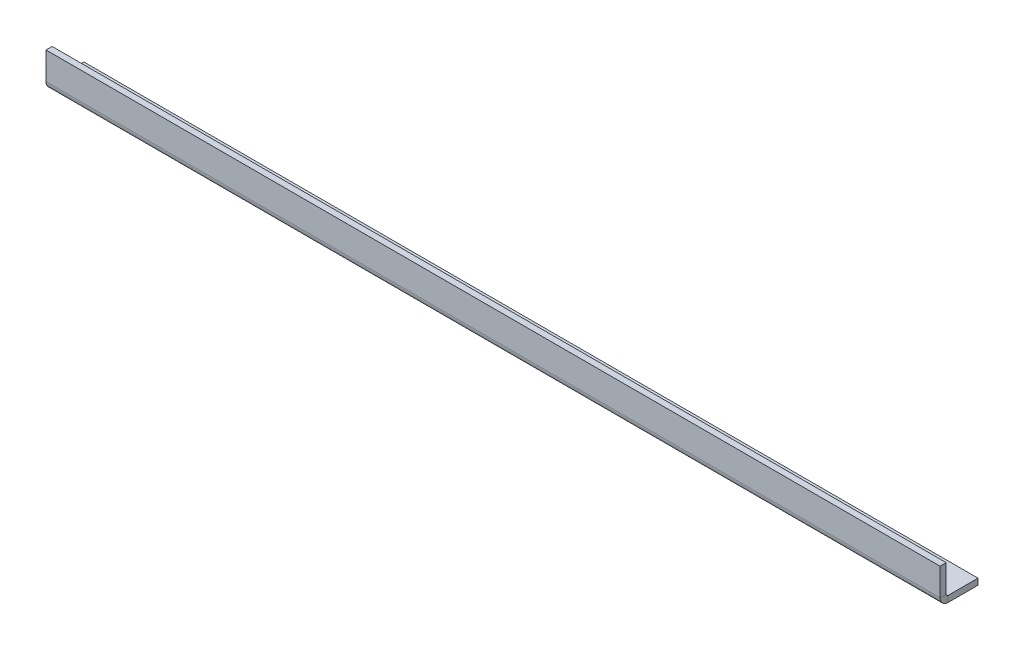
ISO-10303-21;
HEADER;
FILE_DESCRIPTION(('STEP AP214'),'2;1');
FILE_NAME('part.step','',(''),(''),'','','');
FILE_SCHEMA(('AUTOMOTIVE_DESIGN { 1 0 10303 214 1 1 1 1 }'));
ENDSEC;
DATA;
#1=APPLICATION_CONTEXT('core data for automotive mechanical design processes');
#2=APPLICATION_PROTOCOL_DEFINITION('international standard','automotive_design',2000,#1);
#3=PRODUCT_CONTEXT('',#1,'mechanical');
#4=PRODUCT('Part','Part','',(#3));
#5=PRODUCT_RELATED_PRODUCT_CATEGORY('part','',(#4));
#6=PRODUCT_DEFINITION_FORMATION('','',#4);
#7=PRODUCT_DEFINITION_CONTEXT('part definition',#1,'design');
#8=PRODUCT_DEFINITION('design','',#6,#7);
#9=PRODUCT_DEFINITION_SHAPE('','',#8);
#10=(LENGTH_UNIT() NAMED_UNIT(*) SI_UNIT(.MILLI.,.METRE.));
#11=(NAMED_UNIT(*) PLANE_ANGLE_UNIT() SI_UNIT($,.RADIAN.));
#12=(NAMED_UNIT(*) SI_UNIT($,.STERADIAN.) SOLID_ANGLE_UNIT());
#13=UNCERTAINTY_MEASURE_WITH_UNIT(LENGTH_MEASURE(1.E-05),#10,'distance_accuracy_value','');
#14=(GEOMETRIC_REPRESENTATION_CONTEXT(3) GLOBAL_UNCERTAINTY_ASSIGNED_CONTEXT((#13)) GLOBAL_UNIT_ASSIGNED_CONTEXT((#10,
#11,#12)) REPRESENTATION_CONTEXT('',''));
#15=CARTESIAN_POINT('',(0.,0.,0.));
#16=DIRECTION('',(0.,0.,1.));
#17=DIRECTION('',(1.,0.,0.));
#18=AXIS2_PLACEMENT_3D('',#15,#16,#17);
#19=CARTESIAN_POINT('',(232.0925,-3.175,-7.62));
#20=DIRECTION('',(1.,0.,0.));
#21=DIRECTION('',(0.,0.,-1.));
#22=AXIS2_PLACEMENT_3D('',#19,#20,#21);
#23=PLANE('',#22);
#24=DIRECTION('',(0.,0.,-1.));
#25=VECTOR('',#24,1.);
#26=CARTESIAN_POINT('',(232.0925,0.,-7.62));
#27=LINE('',#26,#25);
#28=CARTESIAN_POINT('',(232.0925,0.,7.89));
#29=VERTEX_POINT('',#28);
#30=CARTESIAN_POINT('',(232.0925,0.,-7.62));
#31=VERTEX_POINT('',#30);
#32=EDGE_CURVE('E183',#29,#31,#27,.T.);
#33=ORIENTED_EDGE('',*,*,#32,.F.);
#34=DIRECTION('',(0.,-1.,0.));
#35=VECTOR('',#34,1.);
#36=CARTESIAN_POINT('',(232.0925,0.,7.89));
#37=LINE('',#36,#35);
#38=CARTESIAN_POINT('',(232.0925,-3.175,7.89));
#39=VERTEX_POINT('',#38);
#40=EDGE_CURVE('E170',#29,#39,#37,.T.);
#41=ORIENTED_EDGE('',*,*,#40,.T.);
#42=DIRECTION('',(0.,0.,-1.));
#43=VECTOR('',#42,1.);
#44=CARTESIAN_POINT('',(232.0925,-3.175,-7.62));
#45=LINE('',#44,#43);
#46=CARTESIAN_POINT('',(232.0925,-3.175,-7.62));
#47=VERTEX_POINT('',#46);
#48=EDGE_CURVE('E186',#39,#47,#45,.T.);
#49=ORIENTED_EDGE('',*,*,#48,.T.);
#50=DIRECTION('',(0.,1.,0.));
#51=VECTOR('',#50,1.);
#52=CARTESIAN_POINT('',(232.0925,-3.175,-7.62));
#53=LINE('',#52,#51);
#54=EDGE_CURVE('E59',#47,#31,#53,.T.);
#55=ORIENTED_EDGE('',*,*,#54,.T.);
#56=EDGE_LOOP('',(#33,#41,#49,#55));
#57=FACE_BOUND('',#56,.T.);
#58=ADVANCED_FACE('F56',(#57),#23,.T.);
#59=CARTESIAN_POINT('',(-232.0925,-3.175,-7.62));
#60=DIRECTION('',(-1.,0.,0.));
#61=DIRECTION('',(0.,0.,1.));
#62=AXIS2_PLACEMENT_3D('',#59,#60,#61);
#63=PLANE('',#62);
#64=DIRECTION('',(0.,0.,1.));
#65=VECTOR('',#64,1.);
#66=CARTESIAN_POINT('',(-232.0925,0.,-7.62));
#67=LINE('',#66,#65);
#68=CARTESIAN_POINT('',(-232.0925,0.,-7.62));
#69=VERTEX_POINT('',#68);
#70=CARTESIAN_POINT('',(-232.0925,0.,7.89));
#71=VERTEX_POINT('',#70);
#72=EDGE_CURVE('E189',#69,#71,#67,.T.);
#73=ORIENTED_EDGE('',*,*,#72,.F.);
#74=DIRECTION('',(0.,1.,0.));
#75=VECTOR('',#74,1.);
#76=CARTESIAN_POINT('',(-232.0925,-3.175,-7.62));
#77=LINE('',#76,#75);
#78=CARTESIAN_POINT('',(-232.0925,-3.175,-7.62));
#79=VERTEX_POINT('',#78);
#80=EDGE_CURVE('E13',#79,#69,#77,.T.);
#81=ORIENTED_EDGE('',*,*,#80,.F.);
#82=DIRECTION('',(0.,0.,1.));
#83=VECTOR('',#82,1.);
#84=CARTESIAN_POINT('',(-232.0925,-3.175,-7.62));
#85=LINE('',#84,#83);
#86=CARTESIAN_POINT('',(-232.0925,-3.175,7.89));
#87=VERTEX_POINT('',#86);
#88=EDGE_CURVE('E192',#79,#87,#85,.T.);
#89=ORIENTED_EDGE('',*,*,#88,.T.);
#90=DIRECTION('',(0.,-1.,0.));
#91=VECTOR('',#90,1.);
#92=CARTESIAN_POINT('',(-232.0925,0.,7.89));
#93=LINE('',#92,#91);
#94=EDGE_CURVE('E181',#71,#87,#93,.T.);
#95=ORIENTED_EDGE('',*,*,#94,.F.);
#96=EDGE_LOOP('',(#73,#81,#89,#95));
#97=FACE_BOUND('',#96,.T.);
#98=ADVANCED_FACE('F204',(#97),#63,.T.);
#99=CARTESIAN_POINT('',(-232.0925,-3.175,-7.62));
#100=DIRECTION('',(0.,0.,-1.));
#101=DIRECTION('',(-1.,0.,0.));
#102=AXIS2_PLACEMENT_3D('',#99,#100,#101);
#103=PLANE('',#102);
#104=DIRECTION('',(-1.,0.,0.));
#105=VECTOR('',#104,1.);
#106=CARTESIAN_POINT('',(-232.0925,0.,-7.62));
#107=LINE('',#106,#105);
#108=EDGE_CURVE('E196',#31,#69,#107,.T.);
#109=ORIENTED_EDGE('',*,*,#108,.F.);
#110=ORIENTED_EDGE('',*,*,#54,.F.);
#111=DIRECTION('',(-1.,0.,0.));
#112=VECTOR('',#111,1.);
#113=CARTESIAN_POINT('',(-232.0925,-3.175,-7.62));
#114=LINE('',#113,#112);
#115=EDGE_CURVE('E188',#47,#79,#114,.T.);
#116=ORIENTED_EDGE('',*,*,#115,.T.);
#117=ORIENTED_EDGE('',*,*,#80,.T.);
#118=EDGE_LOOP('',(#109,#110,#116,#117));
#119=FACE_BOUND('',#118,.T.);
#120=ADVANCED_FACE('F229',(#119),#103,.T.);
#121=CARTESIAN_POINT('',(0.,-3.175,0.));
#122=DIRECTION('',(0.,1.,0.));
#123=DIRECTION('',(0.,0.,1.));
#124=AXIS2_PLACEMENT_3D('',#121,#122,#123);
#125=PLANE('',#124);
#126=ORIENTED_EDGE('',*,*,#48,.F.);
#127=DIRECTION('',(1.,0.,0.));
#128=VECTOR('',#127,1.);
#129=CARTESIAN_POINT('',(232.0925,-3.175,7.89));
#130=LINE('',#129,#128);
#131=EDGE_CURVE('E165',#39,#87,#130,.F.);
#132=ORIENTED_EDGE('',*,*,#131,.T.);
#133=ORIENTED_EDGE('',*,*,#88,.F.);
#134=ORIENTED_EDGE('',*,*,#115,.F.);
#135=EDGE_LOOP('',(#126,#132,#133,#134));
#136=FACE_BOUND('',#135,.T.);
#137=ADVANCED_FACE('F223',(#136),#125,.F.);
#138=CARTESIAN_POINT('',(0.,0.,0.));
#139=DIRECTION('',(0.,1.,0.));
#140=DIRECTION('',(0.,0.,1.));
#141=AXIS2_PLACEMENT_3D('',#138,#139,#140);
#142=PLANE('',#141);
#143=ORIENTED_EDGE('',*,*,#32,.T.);
#144=ORIENTED_EDGE('',*,*,#108,.T.);
#145=ORIENTED_EDGE('',*,*,#72,.T.);
#146=DIRECTION('',(1.,0.,0.));
#147=VECTOR('',#146,1.);
#148=CARTESIAN_POINT('',(232.0925,0.,7.89));
#149=LINE('',#148,#147);
#150=EDGE_CURVE('E176',#29,#71,#149,.F.);
#151=ORIENTED_EDGE('',*,*,#150,.F.);
#152=EDGE_LOOP('',(#143,#144,#145,#151));
#153=FACE_BOUND('',#152,.T.);
#154=ADVANCED_FACE('F203',(#153),#142,.T.);
#155=CARTESIAN_POINT('',(-232.0925,1.,7.89));
#156=DIRECTION('',(-1.,0.,0.));
#157=DIRECTION('',(0.,0.,1.));
#158=AXIS2_PLACEMENT_3D('',#155,#156,#157);
#159=PLANE('',#158);
#160=DIRECTION('',(0.,0.,-1.));
#161=VECTOR('',#160,1.);
#162=CARTESIAN_POINT('',(-232.0925,0.999999999999997,12.065));
#163=LINE('',#162,#161);
#164=CARTESIAN_POINT('',(-232.0925,1.,8.89));
#165=VERTEX_POINT('',#164);
#166=CARTESIAN_POINT('',(-232.0925,1.,12.065));
#167=VERTEX_POINT('',#166);
#168=EDGE_CURVE('E147',#165,#167,#163,.F.);
#169=ORIENTED_EDGE('',*,*,#168,.F.);
#170=CARTESIAN_POINT('',(-232.0925,1.,7.89));
#171=DIRECTION('',(1.,0.,0.));
#172=DIRECTION('',(0.,0.,-1.));
#173=AXIS2_PLACEMENT_3D('',#170,#171,#172);
#174=CIRCLE('',#173,0.999999999999999);
#175=EDGE_CURVE('E173',#71,#165,#174,.F.);
#176=ORIENTED_EDGE('',*,*,#175,.F.);
#177=ORIENTED_EDGE('',*,*,#94,.T.);
#178=CARTESIAN_POINT('',(-232.0925,1.,7.89));
#179=DIRECTION('',(1.,0.,0.));
#180=DIRECTION('',(0.,0.,-1.));
#181=AXIS2_PLACEMENT_3D('',#178,#179,#180);
#182=CIRCLE('',#181,4.175);
#183=EDGE_CURVE('E88',#87,#167,#182,.F.);
#184=ORIENTED_EDGE('',*,*,#183,.T.);
#185=EDGE_LOOP('',(#169,#176,#177,#184));
#186=FACE_BOUND('',#185,.T.);
#187=ADVANCED_FACE('F207',(#186),#159,.T.);
#188=CARTESIAN_POINT('',(232.0925,1.,7.89));
#189=DIRECTION('',(-1.,0.,0.));
#190=DIRECTION('',(0.,0.,1.));
#191=AXIS2_PLACEMENT_3D('',#188,#189,#190);
#192=PLANE('',#191);
#193=CARTESIAN_POINT('',(232.0925,1.,7.89));
#194=DIRECTION('',(1.,0.,0.));
#195=DIRECTION('',(0.,0.,-1.));
#196=AXIS2_PLACEMENT_3D('',#193,#194,#195);
#197=CIRCLE('',#196,0.999999999999999);
#198=CARTESIAN_POINT('',(232.0925,1.,8.89));
#199=VERTEX_POINT('',#198);
#200=EDGE_CURVE('E178',#199,#29,#197,.T.);
#201=ORIENTED_EDGE('',*,*,#200,.F.);
#202=DIRECTION('',(0.,0.,-1.));
#203=VECTOR('',#202,1.);
#204=CARTESIAN_POINT('',(232.0925,1.00000000000001,8.89));
#205=LINE('',#204,#203);
#206=CARTESIAN_POINT('',(232.0925,1.00000000000001,12.065));
#207=VERTEX_POINT('',#206);
#208=EDGE_CURVE('E159',#199,#207,#205,.F.);
#209=ORIENTED_EDGE('',*,*,#208,.T.);
#210=CARTESIAN_POINT('',(232.0925,1.,7.89));
#211=DIRECTION('',(1.,0.,0.));
#212=DIRECTION('',(0.,0.,-1.));
#213=AXIS2_PLACEMENT_3D('',#210,#211,#212);
#214=CIRCLE('',#213,4.175);
#215=EDGE_CURVE('E168',#207,#39,#214,.T.);
#216=ORIENTED_EDGE('',*,*,#215,.T.);
#217=ORIENTED_EDGE('',*,*,#40,.F.);
#218=EDGE_LOOP('',(#201,#209,#216,#217));
#219=FACE_BOUND('',#218,.T.);
#220=ADVANCED_FACE('F219',(#219),#192,.F.);
#221=CARTESIAN_POINT('',(232.0925,1.,7.89));
#222=DIRECTION('',(1.,0.,0.));
#223=DIRECTION('',(0.,0.,1.));
#224=AXIS2_PLACEMENT_3D('',#221,#222,#223);
#225=CYLINDRICAL_SURFACE('',#224,4.175);
#226=ORIENTED_EDGE('',*,*,#131,.F.);
#227=ORIENTED_EDGE('',*,*,#215,.F.);
#228=DIRECTION('',(1.,0.,0.));
#229=VECTOR('',#228,1.);
#230=CARTESIAN_POINT('',(-232.0925,0.999999999999997,12.065));
#231=LINE('',#230,#229);
#232=EDGE_CURVE('E157',#207,#167,#231,.F.);
#233=ORIENTED_EDGE('',*,*,#232,.T.);
#234=ORIENTED_EDGE('',*,*,#183,.F.);
#235=EDGE_LOOP('',(#226,#227,#233,#234));
#236=FACE_BOUND('',#235,.T.);
#237=ADVANCED_FACE('F221',(#236),#225,.T.);
#238=CARTESIAN_POINT('',(232.0925,1.,7.89));
#239=DIRECTION('',(1.,0.,0.));
#240=DIRECTION('',(0.,0.,1.));
#241=AXIS2_PLACEMENT_3D('',#238,#239,#240);
#242=CYLINDRICAL_SURFACE('',#241,0.999999999999999);
#243=ORIENTED_EDGE('',*,*,#150,.T.);
#244=ORIENTED_EDGE('',*,*,#175,.T.);
#245=DIRECTION('',(1.,0.,0.));
#246=VECTOR('',#245,1.);
#247=CARTESIAN_POINT('',(-232.0925,0.999999999999997,8.89));
#248=LINE('',#247,#246);
#249=EDGE_CURVE('E162',#165,#199,#248,.T.);
#250=ORIENTED_EDGE('',*,*,#249,.T.);
#251=ORIENTED_EDGE('',*,*,#200,.T.);
#252=EDGE_LOOP('',(#243,#244,#250,#251));
#253=FACE_BOUND('',#252,.T.);
#254=ADVANCED_FACE('F210',(#253),#242,.F.);
#255=CARTESIAN_POINT('',(232.0925,15.24,12.065));
#256=DIRECTION('',(-1.,0.,0.));
#257=DIRECTION('',(0.,0.,1.));
#258=AXIS2_PLACEMENT_3D('',#255,#256,#257);
#259=PLANE('',#258);
#260=ORIENTED_EDGE('',*,*,#208,.F.);
#261=DIRECTION('',(0.,-1.,0.));
#262=VECTOR('',#261,1.);
#263=CARTESIAN_POINT('',(232.0925,15.24,8.89));
#264=LINE('',#263,#262);
#265=CARTESIAN_POINT('',(232.0925,15.24,8.89));
#266=VERTEX_POINT('',#265);
#267=EDGE_CURVE('E155',#199,#266,#264,.F.);
#268=ORIENTED_EDGE('',*,*,#267,.T.);
#269=DIRECTION('',(0.,0.,-1.));
#270=VECTOR('',#269,1.);
#271=CARTESIAN_POINT('',(232.0925,15.24,12.065));
#272=LINE('',#271,#270);
#273=CARTESIAN_POINT('',(232.0925,15.24,12.065));
#274=VERTEX_POINT('',#273);
#275=EDGE_CURVE('E143',#274,#266,#272,.T.);
#276=ORIENTED_EDGE('',*,*,#275,.F.);
#277=DIRECTION('',(0.,1.,0.));
#278=VECTOR('',#277,1.);
#279=CARTESIAN_POINT('',(232.0925,0.,12.065));
#280=LINE('',#279,#278);
#281=EDGE_CURVE('E130',#207,#274,#280,.T.);
#282=ORIENTED_EDGE('',*,*,#281,.F.);
#283=EDGE_LOOP('',(#260,#268,#276,#282));
#284=FACE_BOUND('',#283,.T.);
#285=ADVANCED_FACE('F217',(#284),#259,.F.);
#286=CARTESIAN_POINT('',(-232.0925,0.,12.065));
#287=DIRECTION('',(1.,0.,0.));
#288=DIRECTION('',(0.,0.,-1.));
#289=AXIS2_PLACEMENT_3D('',#286,#287,#288);
#290=PLANE('',#289);
#291=ORIENTED_EDGE('',*,*,#168,.T.);
#292=DIRECTION('',(0.,-1.,0.));
#293=VECTOR('',#292,1.);
#294=CARTESIAN_POINT('',(-232.0925,0.,12.065));
#295=LINE('',#294,#293);
#296=CARTESIAN_POINT('',(-232.0925,15.24,12.065));
#297=VERTEX_POINT('',#296);
#298=EDGE_CURVE('E128',#297,#167,#295,.T.);
#299=ORIENTED_EDGE('',*,*,#298,.F.);
#300=DIRECTION('',(0.,0.,-1.));
#301=VECTOR('',#300,1.);
#302=CARTESIAN_POINT('',(-232.0925,15.24,12.065));
#303=LINE('',#302,#301);
#304=CARTESIAN_POINT('',(-232.0925,15.24,8.89));
#305=VERTEX_POINT('',#304);
#306=EDGE_CURVE('E136',#297,#305,#303,.T.);
#307=ORIENTED_EDGE('',*,*,#306,.T.);
#308=DIRECTION('',(0.,1.,0.));
#309=VECTOR('',#308,1.);
#310=CARTESIAN_POINT('',(-232.0925,0.,8.89));
#311=LINE('',#310,#309);
#312=EDGE_CURVE('E152',#305,#165,#311,.F.);
#313=ORIENTED_EDGE('',*,*,#312,.T.);
#314=EDGE_LOOP('',(#291,#299,#307,#313));
#315=FACE_BOUND('',#314,.T.);
#316=ADVANCED_FACE('F146',(#315),#290,.F.);
#317=CARTESIAN_POINT('',(0.,0.,12.065));
#318=DIRECTION('',(0.,0.,-1.));
#319=DIRECTION('',(-1.,0.,0.));
#320=AXIS2_PLACEMENT_3D('',#317,#318,#319);
#321=PLANE('',#320);
#322=ORIENTED_EDGE('',*,*,#232,.F.);
#323=ORIENTED_EDGE('',*,*,#281,.T.);
#324=DIRECTION('',(-1.,0.,0.));
#325=VECTOR('',#324,1.);
#326=CARTESIAN_POINT('',(0.,15.24,12.065));
#327=LINE('',#326,#325);
#328=EDGE_CURVE('E123',#274,#297,#327,.T.);
#329=ORIENTED_EDGE('',*,*,#328,.T.);
#330=ORIENTED_EDGE('',*,*,#298,.T.);
#331=EDGE_LOOP('',(#322,#323,#329,#330));
#332=FACE_BOUND('',#331,.T.);
#333=ADVANCED_FACE('F126',(#332),#321,.F.);
#334=CARTESIAN_POINT('',(0.,0.,8.89));
#335=DIRECTION('',(0.,0.,-1.));
#336=DIRECTION('',(-1.,0.,0.));
#337=AXIS2_PLACEMENT_3D('',#334,#335,#336);
#338=PLANE('',#337);
#339=ORIENTED_EDGE('',*,*,#267,.F.);
#340=ORIENTED_EDGE('',*,*,#249,.F.);
#341=ORIENTED_EDGE('',*,*,#312,.F.);
#342=DIRECTION('',(1.,0.,0.));
#343=VECTOR('',#342,1.);
#344=CARTESIAN_POINT('',(-232.0925,15.24,8.89));
#345=LINE('',#344,#343);
#346=EDGE_CURVE('E139',#266,#305,#345,.F.);
#347=ORIENTED_EDGE('',*,*,#346,.F.);
#348=EDGE_LOOP('',(#339,#340,#341,#347));
#349=FACE_BOUND('',#348,.T.);
#350=ADVANCED_FACE('F214',(#349),#338,.T.);
#351=CARTESIAN_POINT('',(-232.0925,15.24,12.065));
#352=DIRECTION('',(0.,-1.,0.));
#353=DIRECTION('',(0.,0.,-1.));
#354=AXIS2_PLACEMENT_3D('',#351,#352,#353);
#355=PLANE('',#354);
#356=ORIENTED_EDGE('',*,*,#346,.T.);
#357=ORIENTED_EDGE('',*,*,#306,.F.);
#358=ORIENTED_EDGE('',*,*,#328,.F.);
#359=ORIENTED_EDGE('',*,*,#275,.T.);
#360=EDGE_LOOP('',(#356,#357,#358,#359));
#361=FACE_BOUND('',#360,.T.);
#362=ADVANCED_FACE('F137',(#361),#355,.F.);
#363=CLOSED_SHELL('',(#58,#98,#120,#137,#154,#187,#220,#237,#254,#285,#316,#333,#350,#362));
#364=MANIFOLD_SOLID_BREP('B2',#363);
#365=ADVANCED_BREP_SHAPE_REPRESENTATION('',(#18,#364),#14);
#366=SHAPE_DEFINITION_REPRESENTATION(#9,#365);
ENDSEC;
END-ISO-10303-21;
